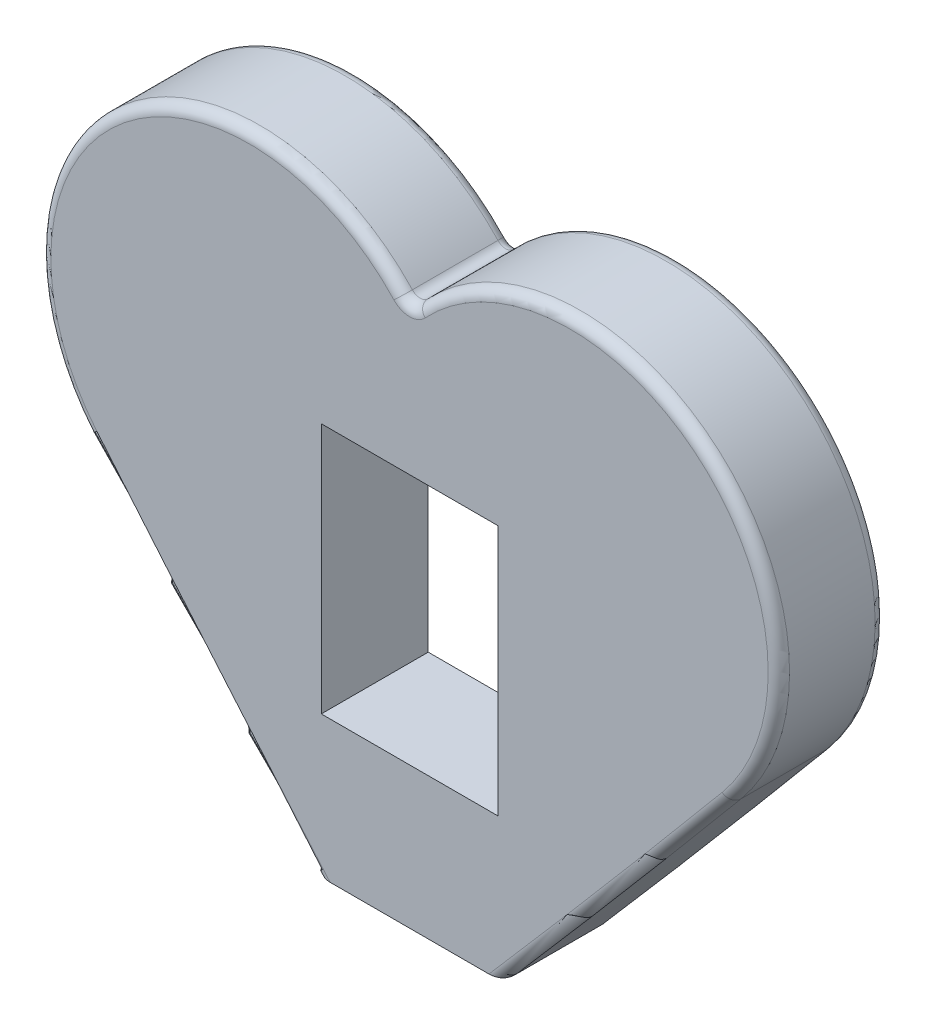
ISO-10303-21;
HEADER;
FILE_DESCRIPTION(('STEP AP214'),'2;1');
FILE_NAME('part.step','',(''),(''),'','','');
FILE_SCHEMA(('AUTOMOTIVE_DESIGN { 1 0 10303 214 1 1 1 1 }'));
ENDSEC;
DATA;
#1=APPLICATION_CONTEXT('core data for automotive mechanical design processes');
#2=APPLICATION_PROTOCOL_DEFINITION('international standard','automotive_design',2000,#1);
#3=PRODUCT_CONTEXT('',#1,'mechanical');
#4=PRODUCT('Part','Part','',(#3));
#5=PRODUCT_RELATED_PRODUCT_CATEGORY('part','',(#4));
#6=PRODUCT_DEFINITION_FORMATION('','',#4);
#7=PRODUCT_DEFINITION_CONTEXT('part definition',#1,'design');
#8=PRODUCT_DEFINITION('design','',#6,#7);
#9=PRODUCT_DEFINITION_SHAPE('','',#8);
#10=(LENGTH_UNIT() NAMED_UNIT(*) SI_UNIT(.MILLI.,.METRE.));
#11=(NAMED_UNIT(*) PLANE_ANGLE_UNIT() SI_UNIT($,.RADIAN.));
#12=(NAMED_UNIT(*) SI_UNIT($,.STERADIAN.) SOLID_ANGLE_UNIT());
#13=UNCERTAINTY_MEASURE_WITH_UNIT(LENGTH_MEASURE(1.E-05),#10,'distance_accuracy_value','');
#14=(GEOMETRIC_REPRESENTATION_CONTEXT(3) GLOBAL_UNCERTAINTY_ASSIGNED_CONTEXT((#13)) GLOBAL_UNIT_ASSIGNED_CONTEXT((#10,
#11,#12)) REPRESENTATION_CONTEXT('',''));
#15=CARTESIAN_POINT('',(0.,0.,0.));
#16=DIRECTION('',(0.,0.,1.));
#17=DIRECTION('',(1.,0.,0.));
#18=AXIS2_PLACEMENT_3D('',#15,#16,#17);
#19=CARTESIAN_POINT('',(2520.6972514821,2152.84342115565,-20.));
#20=DIRECTION('',(0.,0.,1.));
#21=DIRECTION('',(1.,0.,0.));
#22=AXIS2_PLACEMENT_3D('',#19,#20,#21);
#23=CYLINDRICAL_SURFACE('',#22,3360.76374967316);
#24=DIRECTION('',(0.,0.,1.));
#25=VECTOR('',#24,1.);
#26=CARTESIAN_POINT('',(-59.9999770017148,-2.18575157973078E-13,-20.));
#27=LINE('',#26,#25);
#28=CARTESIAN_POINT('',(-59.9999770017148,-2.18575157973078E-13,-18.));
#29=VERTEX_POINT('',#28);
#30=CARTESIAN_POINT('',(-59.9999770017148,-2.18575157973078E-13,-2.));
#31=VERTEX_POINT('',#30);
#32=EDGE_CURVE('E452',#29,#31,#27,.T.);
#33=ORIENTED_EDGE('',*,*,#32,.F.);
#34=CARTESIAN_POINT('',(2520.6972514821,2152.84342115565,-18.));
#35=DIRECTION('',(0.,0.,-1.));
#36=DIRECTION('',(-1.,0.,0.));
#37=AXIS2_PLACEMENT_3D('',#34,#35,#36);
#38=CIRCLE('',#37,3360.76374967316);
#39=CARTESIAN_POINT('',(-18.098243056407,-49.2579430027272,-18.));
#40=VERTEX_POINT('',#39);
#41=EDGE_CURVE('E228',#29,#40,#38,.F.);
#42=ORIENTED_EDGE('',*,*,#41,.T.);
#43=DIRECTION('',(0.,0.,1.));
#44=VECTOR('',#43,1.);
#45=CARTESIAN_POINT('',(-18.0982430564076,-49.2579430027273,-20.));
#46=LINE('',#45,#44);
#47=CARTESIAN_POINT('',(-18.098243056407,-49.2579430027272,-2.));
#48=VERTEX_POINT('',#47);
#49=EDGE_CURVE('E451',#40,#48,#46,.T.);
#50=ORIENTED_EDGE('',*,*,#49,.T.);
#51=CARTESIAN_POINT('',(2520.6972514821,2152.84342115565,-2.));
#52=DIRECTION('',(0.,0.,-1.));
#53=DIRECTION('',(-1.,0.,0.));
#54=AXIS2_PLACEMENT_3D('',#51,#52,#53);
#55=CIRCLE('',#54,3360.76374967316);
#56=EDGE_CURVE('E446',#48,#31,#55,.T.);
#57=ORIENTED_EDGE('',*,*,#56,.T.);
#58=EDGE_LOOP('',(#33,#42,#50,#57));
#59=FACE_BOUND('',#58,.T.);
#60=ADVANCED_FACE('F39',(#59),#23,.T.);
#61=CARTESIAN_POINT('',(-30.,25.0262806539722,-20.));
#62=DIRECTION('',(0.,0.,1.));
#63=DIRECTION('',(1.,0.,0.));
#64=AXIS2_PLACEMENT_3D('',#61,#62,#63);
#65=CYLINDRICAL_SURFACE('',#64,39.0680604007265);
#66=DIRECTION('',(0.,0.,1.));
#67=VECTOR('',#66,1.);
#68=CARTESIAN_POINT('',(-1.46098937750025,51.7065770571919,-20.));
#69=LINE('',#68,#67);
#70=CARTESIAN_POINT('',(-1.46098937750025,51.7065770571919,-2.));
#71=VERTEX_POINT('',#70);
#72=CARTESIAN_POINT('',(-1.46098937750025,51.7065770571919,-18.));
#73=VERTEX_POINT('',#72);
#74=EDGE_CURVE('E393',#71,#73,#69,.F.);
#75=ORIENTED_EDGE('',*,*,#74,.T.);
#76=CARTESIAN_POINT('',(-30.,25.0262806539722,-18.));
#77=DIRECTION('',(0.,0.,-1.));
#78=DIRECTION('',(-1.,0.,0.));
#79=AXIS2_PLACEMENT_3D('',#76,#77,#78);
#80=CIRCLE('',#79,39.0680604007265);
#81=EDGE_CURVE('E354',#73,#29,#80,.F.);
#82=ORIENTED_EDGE('',*,*,#81,.T.);
#83=ORIENTED_EDGE('',*,*,#32,.T.);
#84=CARTESIAN_POINT('',(-30.,25.0262806539722,-2.));
#85=DIRECTION('',(0.,0.,-1.));
#86=DIRECTION('',(-1.,0.,0.));
#87=AXIS2_PLACEMENT_3D('',#84,#85,#86);
#88=CIRCLE('',#87,39.0680604007265);
#89=EDGE_CURVE('E391',#31,#71,#88,.T.);
#90=ORIENTED_EDGE('',*,*,#89,.T.);
#91=EDGE_LOOP('',(#75,#82,#83,#90));
#92=FACE_BOUND('',#91,.T.);
#93=ADVANCED_FACE('F505',(#92),#65,.T.);
#94=CARTESIAN_POINT('',(30.,25.0262806539722,-20.));
#95=DIRECTION('',(0.,0.,1.));
#96=DIRECTION('',(1.,0.,0.));
#97=AXIS2_PLACEMENT_3D('',#94,#95,#96);
#98=CYLINDRICAL_SURFACE('',#97,39.0680604007265);
#99=DIRECTION('',(0.,0.,1.));
#100=VECTOR('',#99,1.);
#101=CARTESIAN_POINT('',(59.9999770017146,-8.88178419700125E-13,-20.));
#102=LINE('',#101,#100);
#103=CARTESIAN_POINT('',(59.9999770017146,-8.88178419700125E-13,-18.));
#104=VERTEX_POINT('',#103);
#105=CARTESIAN_POINT('',(59.9999770017146,-8.88178419700125E-13,-2.));
#106=VERTEX_POINT('',#105);
#107=EDGE_CURVE('E368',#104,#106,#102,.T.);
#108=ORIENTED_EDGE('',*,*,#107,.F.);
#109=CARTESIAN_POINT('',(30.,25.0262806539722,-18.));
#110=DIRECTION('',(0.,0.,-1.));
#111=DIRECTION('',(-1.,0.,0.));
#112=AXIS2_PLACEMENT_3D('',#109,#110,#111);
#113=CIRCLE('',#112,39.0680604007265);
#114=CARTESIAN_POINT('',(1.46098937750025,51.7065770571919,-18.));
#115=VERTEX_POINT('',#114);
#116=EDGE_CURVE('E169',#104,#115,#113,.F.);
#117=ORIENTED_EDGE('',*,*,#116,.T.);
#118=DIRECTION('',(0.,0.,1.));
#119=VECTOR('',#118,1.);
#120=CARTESIAN_POINT('',(1.46098937750025,51.7065770571919,-20.));
#121=LINE('',#120,#119);
#122=CARTESIAN_POINT('',(1.46098937750025,51.7065770571919,-2.));
#123=VERTEX_POINT('',#122);
#124=EDGE_CURVE('E359',#115,#123,#121,.T.);
#125=ORIENTED_EDGE('',*,*,#124,.T.);
#126=CARTESIAN_POINT('',(30.,25.0262806539722,-2.));
#127=DIRECTION('',(0.,0.,-1.));
#128=DIRECTION('',(-1.,0.,0.));
#129=AXIS2_PLACEMENT_3D('',#126,#127,#128);
#130=CIRCLE('',#129,39.0680604007265);
#131=EDGE_CURVE('E352',#123,#106,#130,.T.);
#132=ORIENTED_EDGE('',*,*,#131,.T.);
#133=EDGE_LOOP('',(#108,#117,#125,#132));
#134=FACE_BOUND('',#133,.T.);
#135=ADVANCED_FACE('F366',(#134),#98,.T.);
#136=CARTESIAN_POINT('',(-2520.6972514821,2152.84342115565,-20.));
#137=DIRECTION('',(0.,0.,1.));
#138=DIRECTION('',(1.,0.,0.));
#139=AXIS2_PLACEMENT_3D('',#136,#137,#138);
#140=CYLINDRICAL_SURFACE('',#139,3360.76374967316);
#141=DIRECTION('',(0.,0.,1.));
#142=VECTOR('',#141,1.);
#143=CARTESIAN_POINT('',(18.0982430564076,-49.2579430027273,-20.));
#144=LINE('',#143,#142);
#145=CARTESIAN_POINT('',(18.098243056407,-49.2579430027272,-2.));
#146=VERTEX_POINT('',#145);
#147=CARTESIAN_POINT('',(18.098243056407,-49.2579430027272,-18.));
#148=VERTEX_POINT('',#147);
#149=EDGE_CURVE('E343',#146,#148,#144,.F.);
#150=ORIENTED_EDGE('',*,*,#149,.T.);
#151=CARTESIAN_POINT('',(-2520.6972514821,2152.84342115565,-18.));
#152=DIRECTION('',(0.,0.,-1.));
#153=DIRECTION('',(-1.,0.,0.));
#154=AXIS2_PLACEMENT_3D('',#151,#152,#153);
#155=CIRCLE('',#154,3360.76374967316);
#156=EDGE_CURVE('E348',#148,#104,#155,.F.);
#157=ORIENTED_EDGE('',*,*,#156,.T.);
#158=ORIENTED_EDGE('',*,*,#107,.T.);
#159=CARTESIAN_POINT('',(-2520.6972514821,2152.84342115565,-2.));
#160=DIRECTION('',(0.,0.,-1.));
#161=DIRECTION('',(-1.,0.,0.));
#162=AXIS2_PLACEMENT_3D('',#159,#160,#161);
#163=CIRCLE('',#162,3360.76374967316);
#164=EDGE_CURVE('E338',#106,#146,#163,.T.);
#165=ORIENTED_EDGE('',*,*,#164,.T.);
#166=EDGE_LOOP('',(#150,#157,#158,#165));
#167=FACE_BOUND('',#166,.T.);
#168=ADVANCED_FACE('F237',(#167),#140,.T.);
#169=CARTESIAN_POINT('',(-17.5,-49.9474662610205,-20.));
#170=DIRECTION('',(0.,-1.,0.));
#171=DIRECTION('',(0.,0.,-1.));
#172=AXIS2_PLACEMENT_3D('',#169,#170,#171);
#173=PLANE('',#172);
#174=DIRECTION('',(0.,0.,-1.));
#175=VECTOR('',#174,1.);
#176=CARTESIAN_POINT('',(-16.5873986867098,-49.9474662610205,-20.));
#177=LINE('',#176,#175);
#178=CARTESIAN_POINT('',(-16.5873986867098,-49.9474662610205,-0.489450322608068));
#179=VERTEX_POINT('',#178);
#180=CARTESIAN_POINT('',(-16.5873986867098,-49.9474662610205,-19.5105496773919));
#181=VERTEX_POINT('',#180);
#182=EDGE_CURVE('E259',#179,#181,#177,.T.);
#183=ORIENTED_EDGE('',*,*,#182,.T.);
#184=CARTESIAN_POINT('',(-16.5873986867098,-49.9474662610205,-19.5105496773919));
#185=CARTESIAN_POINT('',(-16.5153228598377,-49.9474662610205,-19.5577619961102));
#186=CARTESIAN_POINT('',(-16.4409518324235,-49.9474662610205,-19.6013591802329));
#187=CARTESIAN_POINT('',(-16.2885779217159,-49.9474662610205,-19.6814631353796));
#188=CARTESIAN_POINT('',(-16.2105790636761,-49.9474662610205,-19.7179775429008));
#189=CARTESIAN_POINT('',(-16.0534828757159,-49.9474662610205,-19.7834344861935));
#190=CARTESIAN_POINT('',(-15.9744467690524,-49.9474662610205,-19.8125250123332));
#191=CARTESIAN_POINT('',(-15.8143151563635,-49.9474662610205,-19.8643192113937));
#192=CARTESIAN_POINT('',(-15.7332193019567,-49.9474662610205,-19.8870217959226));
#193=CARTESIAN_POINT('',(-15.5216560566419,-49.9474662610205,-19.9376261583661));
#194=CARTESIAN_POINT('',(-15.3900254952697,-49.9474662610205,-19.9608159704249));
#195=CARTESIAN_POINT('',(-15.1901607707434,-49.9474662610205,-19.984237116112));
#196=CARTESIAN_POINT('',(-15.1225264766685,-49.9474662610205,-19.9901504220553));
#197=CARTESIAN_POINT('',(-14.9870200709293,-49.9474662610205,-19.9980296242235));
#198=CARTESIAN_POINT('',(-14.9191479325005,-49.9474662610205,-19.9999950609092));
#199=CARTESIAN_POINT('',(-14.851255731397,-49.9474662610205,-20.));
#200=B_SPLINE_CURVE_WITH_KNOTS('',3,(#184,#185,#186,#187,#188,#189,#190,#191,#192,#193,#194,
#195,#196,#197,#198,#199),.UNSPECIFIED.,.F.,.F.,(4,2,2,2,2,2,2,4),(0.,0.25829175180928,
0.516303451908564,0.768678556067953,1.02109663447031,1.4209912929441,1.62457487932923,
1.82818216184009),.UNSPECIFIED.);
#201=CARTESIAN_POINT('',(-14.851255731397,-49.9474662610205,-20.));
#202=VERTEX_POINT('',#201);
#203=EDGE_CURVE('E426',#181,#202,#200,.T.);
#204=ORIENTED_EDGE('',*,*,#203,.T.);
#205=DIRECTION('',(1.,0.,0.));
#206=VECTOR('',#205,1.);
#207=CARTESIAN_POINT('',(-17.5,-49.9474662610205,-20.));
#208=LINE('',#207,#206);
#209=CARTESIAN_POINT('',(14.8512557313972,-49.9474662610205,-20.));
#210=VERTEX_POINT('',#209);
#211=EDGE_CURVE('E461',#202,#210,#208,.T.);
#212=ORIENTED_EDGE('',*,*,#211,.T.);
#213=CARTESIAN_POINT('',(14.8512557313972,-49.9474662610207,-20.));
#214=CARTESIAN_POINT('',(14.9367647935638,-49.9474662610206,-19.9999890761961));
#215=CARTESIAN_POINT('',(15.0222412485081,-49.9474662610205,-19.9968745349572));
#216=CARTESIAN_POINT('',(15.1927730242631,-49.9474662610204,-19.9843700942181));
#217=CARTESIAN_POINT('',(15.2778281289432,-49.9474662610204,-19.9749772545478));
#218=CARTESIAN_POINT('',(15.5277686945291,-49.9474662610205,-19.9378680026166));
#219=CARTESIAN_POINT('',(15.6914461582582,-49.9474662610205,-19.9012196923784));
#220=CARTESIAN_POINT('',(15.97978892835,-49.9474662610204,-19.8124702730638));
#221=CARTESIAN_POINT('',(16.1058200566767,-49.9474662610205,-19.7647971579575));
#222=CARTESIAN_POINT('',(16.2901510709762,-49.9474662610205,-19.6801305308862));
#223=CARTESIAN_POINT('',(16.3513427970364,-49.9474662610205,-19.6493738293372));
#224=CARTESIAN_POINT('',(16.4713089024383,-49.9474662610205,-19.5833609635013));
#225=CARTESIAN_POINT('',(16.5300812980831,-49.9474662610205,-19.5481012004758));
#226=CARTESIAN_POINT('',(16.5873986867099,-49.9474662610205,-19.5105496773925));
#227=B_SPLINE_CURVE_WITH_KNOTS('',3,(#213,#214,#215,#216,#217,#218,#219,#220,#221,#222,#223,
#224,#225,#226),.UNSPECIFIED.,.F.,.F.,(4,2,2,2,2,2,4),(0.,0.256402923976392,0.512926007407789,
1.01403560240191,1.41707289862381,1.62235933318566,1.82781086658069),.UNSPECIFIED.);
#228=CARTESIAN_POINT('',(16.5873986867098,-49.9474662610205,-19.5105496773919));
#229=VERTEX_POINT('',#228);
#230=EDGE_CURVE('E245',#210,#229,#227,.T.);
#231=ORIENTED_EDGE('',*,*,#230,.T.);
#232=DIRECTION('',(0.,0.,1.));
#233=VECTOR('',#232,1.);
#234=CARTESIAN_POINT('',(16.5873986867098,-49.9474662610205,-20.));
#235=LINE('',#234,#233);
#236=CARTESIAN_POINT('',(16.5873986867098,-49.9474662610205,-0.489450322608068));
#237=VERTEX_POINT('',#236);
#238=EDGE_CURVE('E227',#229,#237,#235,.T.);
#239=ORIENTED_EDGE('',*,*,#238,.T.);
#240=CARTESIAN_POINT('',(16.5873986867098,-49.9474662610205,-0.489450322608068));
#241=CARTESIAN_POINT('',(16.5153228598377,-49.9474662610205,-0.442238003889821));
#242=CARTESIAN_POINT('',(16.4409518324235,-49.9474662610205,-0.39864081976712));
#243=CARTESIAN_POINT('',(16.2885779217159,-49.9474662610205,-0.318536864620431));
#244=CARTESIAN_POINT('',(16.2105790636761,-49.9474662610205,-0.282022457099194));
#245=CARTESIAN_POINT('',(16.0534828757159,-49.9474662610205,-0.216565513806549));
#246=CARTESIAN_POINT('',(15.9744467690524,-49.9474662610205,-0.187474987666843));
#247=CARTESIAN_POINT('',(15.8143151563635,-49.9474662610205,-0.135680788606253));
#248=CARTESIAN_POINT('',(15.7332193019567,-49.9474662610205,-0.112978204077412));
#249=CARTESIAN_POINT('',(15.5216560566419,-49.9474662610205,-0.0623738416339182));
#250=CARTESIAN_POINT('',(15.3900254952698,-49.9474662610205,-0.03918402957513));
#251=CARTESIAN_POINT('',(15.1901607707435,-49.9474662610205,-0.0157628838880028));
#252=CARTESIAN_POINT('',(15.1225264766686,-49.9474662610205,-0.00984957794469531));
#253=CARTESIAN_POINT('',(14.9870200709294,-49.9474662610205,-0.00197037577653597));
#254=CARTESIAN_POINT('',(14.9191479325007,-49.9474662610205,-4.93909082584249E-06));
#255=CARTESIAN_POINT('',(14.8512557313971,-49.9474662610205,0.));
#256=B_SPLINE_CURVE_WITH_KNOTS('',3,(#240,#241,#242,#243,#244,#245,#246,#247,#248,#249,#250,
#251,#252,#253,#254,#255),.UNSPECIFIED.,.F.,.F.,(4,2,2,2,2,2,2,4),(0.,0.258291751809279,
0.516303451908564,0.768678556067953,1.02109663447031,1.42099129294403,1.62457487932912,
1.82818216183994),.UNSPECIFIED.);
#257=CARTESIAN_POINT('',(14.8512557313971,-49.9474662610205,0.));
#258=VERTEX_POINT('',#257);
#259=EDGE_CURVE('E218',#237,#258,#256,.T.);
#260=ORIENTED_EDGE('',*,*,#259,.T.);
#261=DIRECTION('',(1.,0.,0.));
#262=VECTOR('',#261,1.);
#263=CARTESIAN_POINT('',(-17.5,-49.9474662610205,0.));
#264=LINE('',#263,#262);
#265=CARTESIAN_POINT('',(-14.8512557313971,-49.9474662610205,0.));
#266=VERTEX_POINT('',#265);
#267=EDGE_CURVE('E196',#266,#258,#264,.T.);
#268=ORIENTED_EDGE('',*,*,#267,.F.);
#269=CARTESIAN_POINT('',(-14.8512557313971,-49.9474662610205,0.));
#270=CARTESIAN_POINT('',(-14.9367647935637,-49.9474662610205,-1.09238039322817E-05));
#271=CARTESIAN_POINT('',(-15.0222412485079,-49.9474662610205,-0.00312546504284668));
#272=CARTESIAN_POINT('',(-15.1927730242629,-49.9474662610205,-0.0156299057818686));
#273=CARTESIAN_POINT('',(-15.2778281289431,-49.9474662610205,-0.0250227454522135));
#274=CARTESIAN_POINT('',(-15.527768694529,-49.9474662610205,-0.0621319973834192));
#275=CARTESIAN_POINT('',(-15.691446158258,-49.9474662610205,-0.0987803076216164));
#276=CARTESIAN_POINT('',(-15.9797889283499,-49.9474662610205,-0.187529726936163));
#277=CARTESIAN_POINT('',(-16.1058200566766,-49.9474662610205,-0.235202842042507));
#278=CARTESIAN_POINT('',(-16.2901510709762,-49.9474662610205,-0.319869469113779));
#279=CARTESIAN_POINT('',(-16.3513427970363,-49.9474662610205,-0.350626170662773));
#280=CARTESIAN_POINT('',(-16.4713089024382,-49.9474662610205,-0.416639036498691));
#281=CARTESIAN_POINT('',(-16.5300812980831,-49.9474662610205,-0.45189879952423));
#282=CARTESIAN_POINT('',(-16.5873986867099,-49.9474662610205,-0.489450322607518));
#283=B_SPLINE_CURVE_WITH_KNOTS('',3,(#269,#270,#271,#272,#273,#274,#275,#276,#277,#278,#279,
#280,#281,#282),.UNSPECIFIED.,.F.,.F.,(4,2,2,2,2,2,4),(0.,0.256402923976391,0.512926007407789,
1.01403560240191,1.41707289862386,1.62235933318575,1.82781086658081),.UNSPECIFIED.);
#284=EDGE_CURVE('E251',#266,#179,#283,.T.);
#285=ORIENTED_EDGE('',*,*,#284,.T.);
#286=EDGE_LOOP('',(#183,#204,#212,#231,#239,#260,#268,#285));
#287=FACE_BOUND('',#286,.T.);
#288=ADVANCED_FACE('F231',(#287),#173,.T.);
#289=CARTESIAN_POINT('',(2520.6972514821,2152.84342115565,-20.));
#290=DIRECTION('',(0.,0.,-1.));
#291=DIRECTION('',(-1.,0.,0.));
#292=AXIS2_PLACEMENT_3D('',#289,#290,#291);
#293=PLANE('',#292);
#294=DIRECTION('',(0.,-1.,0.));
#295=VECTOR('',#294,1.);
#296=CARTESIAN_POINT('',(16.5000000000002,2152.84342115565,-20.));
#297=LINE('',#296,#295);
#298=CARTESIAN_POINT('',(16.5,23.5,-20.));
#299=VERTEX_POINT('',#298);
#300=CARTESIAN_POINT('',(16.5,-23.5,-20.));
#301=VERTEX_POINT('',#300);
#302=EDGE_CURVE('E283',#299,#301,#297,.T.);
#303=ORIENTED_EDGE('',*,*,#302,.F.);
#304=DIRECTION('',(1.,0.,0.));
#305=VECTOR('',#304,1.);
#306=CARTESIAN_POINT('',(2520.6972514821,23.4999999999999,-20.));
#307=LINE('',#306,#305);
#308=CARTESIAN_POINT('',(-16.4999999999997,23.4999999999999,-20.));
#309=VERTEX_POINT('',#308);
#310=EDGE_CURVE('E474',#309,#299,#307,.T.);
#311=ORIENTED_EDGE('',*,*,#310,.F.);
#312=DIRECTION('',(0.,1.,0.));
#313=VECTOR('',#312,1.);
#314=CARTESIAN_POINT('',(-16.5000000000002,2152.84342115565,-20.));
#315=LINE('',#314,#313);
#316=CARTESIAN_POINT('',(-16.5,-23.5,-20.));
#317=VERTEX_POINT('',#316);
#318=EDGE_CURVE('E176',#317,#309,#315,.T.);
#319=ORIENTED_EDGE('',*,*,#318,.F.);
#320=DIRECTION('',(-1.,0.,0.));
#321=VECTOR('',#320,1.);
#322=CARTESIAN_POINT('',(2520.6972514821,-23.4999999999999,-20.));
#323=LINE('',#322,#321);
#324=EDGE_CURVE('E469',#301,#317,#323,.T.);
#325=ORIENTED_EDGE('',*,*,#324,.F.);
#326=EDGE_LOOP('',(#303,#311,#319,#325));
#327=FACE_BOUND('',#326,.T.);
#328=ORIENTED_EDGE('',*,*,#211,.F.);
#329=CARTESIAN_POINT('',(2520.6972514821,2152.84342115565,-20.));
#330=DIRECTION('',(0.,0.,-1.));
#331=DIRECTION('',(-1.,0.,0.));
#332=AXIS2_PLACEMENT_3D('',#329,#330,#331);
#333=CIRCLE('',#332,3358.76374967316);
#334=CARTESIAN_POINT('',(-58.4641967917939,1.28116320069487,-20.));
#335=VERTEX_POINT('',#334);
#336=EDGE_CURVE('E414',#202,#335,#333,.T.);
#337=ORIENTED_EDGE('',*,*,#336,.T.);
#338=CARTESIAN_POINT('',(-30.,25.0262806539722,-20.));
#339=DIRECTION('',(0.,0.,-1.));
#340=DIRECTION('',(-1.,0.,0.));
#341=AXIS2_PLACEMENT_3D('',#338,#339,#340);
#342=CIRCLE('',#341,37.0680604007265);
#343=CARTESIAN_POINT('',(-2.9219787550005,50.3407403030989,-20.));
#344=VERTEX_POINT('',#343);
#345=EDGE_CURVE('E417',#335,#344,#342,.T.);
#346=ORIENTED_EDGE('',*,*,#345,.T.);
#347=CARTESIAN_POINT('',(0.,53.072413811285,-20.));
#348=DIRECTION('',(0.,0.,-1.));
#349=DIRECTION('',(-1.,0.,0.));
#350=AXIS2_PLACEMENT_3D('',#347,#348,#349);
#351=CIRCLE('',#350,4.);
#352=CARTESIAN_POINT('',(2.9219787550005,50.3407403030989,-20.));
#353=VERTEX_POINT('',#352);
#354=EDGE_CURVE('E381',#353,#344,#351,.T.);
#355=ORIENTED_EDGE('',*,*,#354,.F.);
#356=CARTESIAN_POINT('',(30.,25.0262806539722,-20.));
#357=DIRECTION('',(0.,0.,-1.));
#358=DIRECTION('',(-1.,0.,0.));
#359=AXIS2_PLACEMENT_3D('',#356,#357,#358);
#360=CIRCLE('',#359,37.0680604007265);
#361=CARTESIAN_POINT('',(58.4641967917934,1.28116320069438,-20.));
#362=VERTEX_POINT('',#361);
#363=EDGE_CURVE('E376',#353,#362,#360,.T.);
#364=ORIENTED_EDGE('',*,*,#363,.T.);
#365=CARTESIAN_POINT('',(-2520.6972514821,2152.84342115565,-20.));
#366=DIRECTION('',(0.,0.,-1.));
#367=DIRECTION('',(-1.,0.,0.));
#368=AXIS2_PLACEMENT_3D('',#365,#366,#367);
#369=CIRCLE('',#368,3358.76374967316);
#370=EDGE_CURVE('E422',#362,#210,#369,.T.);
#371=ORIENTED_EDGE('',*,*,#370,.T.);
#372=EDGE_LOOP('',(#328,#337,#346,#355,#364,#371));
#373=FACE_BOUND('',#372,.T.);
#374=ADVANCED_FACE('F236',(#327,#373),#293,.T.);
#375=CARTESIAN_POINT('',(2520.6972514821,2152.84342115565,0.));
#376=DIRECTION('',(0.,0.,-1.));
#377=DIRECTION('',(-1.,0.,0.));
#378=AXIS2_PLACEMENT_3D('',#375,#376,#377);
#379=PLANE('',#378);
#380=DIRECTION('',(1.,0.,0.));
#381=VECTOR('',#380,1.);
#382=CARTESIAN_POINT('',(2520.6972514821,23.4999999999999,0.));
#383=LINE('',#382,#381);
#384=CARTESIAN_POINT('',(-16.5,23.5,0.));
#385=VERTEX_POINT('',#384);
#386=CARTESIAN_POINT('',(16.4999999999997,23.4999999999999,0.));
#387=VERTEX_POINT('',#386);
#388=EDGE_CURVE('E163',#385,#387,#383,.T.);
#389=ORIENTED_EDGE('',*,*,#388,.T.);
#390=DIRECTION('',(0.,-1.,0.));
#391=VECTOR('',#390,1.);
#392=CARTESIAN_POINT('',(16.5000000000002,2152.84342115565,0.));
#393=LINE('',#392,#391);
#394=CARTESIAN_POINT('',(16.5,-23.5,0.));
#395=VERTEX_POINT('',#394);
#396=EDGE_CURVE('E11',#387,#395,#393,.T.);
#397=ORIENTED_EDGE('',*,*,#396,.T.);
#398=DIRECTION('',(-1.,0.,0.));
#399=VECTOR('',#398,1.);
#400=CARTESIAN_POINT('',(2520.6972514821,-23.4999999999999,0.));
#401=LINE('',#400,#399);
#402=CARTESIAN_POINT('',(-16.5,-23.5,0.));
#403=VERTEX_POINT('',#402);
#404=EDGE_CURVE('E49',#395,#403,#401,.T.);
#405=ORIENTED_EDGE('',*,*,#404,.T.);
#406=DIRECTION('',(0.,1.,0.));
#407=VECTOR('',#406,1.);
#408=CARTESIAN_POINT('',(-16.5000000000002,2152.84342115565,0.));
#409=LINE('',#408,#407);
#410=EDGE_CURVE('E168',#403,#385,#409,.T.);
#411=ORIENTED_EDGE('',*,*,#410,.T.);
#412=EDGE_LOOP('',(#389,#397,#405,#411));
#413=FACE_BOUND('',#412,.T.);
#414=CARTESIAN_POINT('',(-30.,25.0262806539722,0.));
#415=DIRECTION('',(0.,0.,-1.));
#416=DIRECTION('',(-1.,0.,0.));
#417=AXIS2_PLACEMENT_3D('',#414,#415,#416);
#418=CIRCLE('',#417,37.0680604007265);
#419=CARTESIAN_POINT('',(-2.9219787550005,50.3407403030989,0.));
#420=VERTEX_POINT('',#419);
#421=CARTESIAN_POINT('',(-58.4641967917938,1.28116320069488,0.));
#422=VERTEX_POINT('',#421);
#423=EDGE_CURVE('E401',#420,#422,#418,.F.);
#424=ORIENTED_EDGE('',*,*,#423,.T.);
#425=CARTESIAN_POINT('',(2520.6972514821,2152.84342115565,0.));
#426=DIRECTION('',(0.,0.,-1.));
#427=DIRECTION('',(-1.,0.,0.));
#428=AXIS2_PLACEMENT_3D('',#425,#426,#427);
#429=CIRCLE('',#428,3358.76374967316);
#430=EDGE_CURVE('E398',#422,#266,#429,.F.);
#431=ORIENTED_EDGE('',*,*,#430,.T.);
#432=ORIENTED_EDGE('',*,*,#267,.T.);
#433=CARTESIAN_POINT('',(-2520.6972514821,2152.84342115565,0.));
#434=DIRECTION('',(0.,0.,-1.));
#435=DIRECTION('',(-1.,0.,0.));
#436=AXIS2_PLACEMENT_3D('',#433,#434,#435);
#437=CIRCLE('',#436,3358.76374967316);
#438=CARTESIAN_POINT('',(58.4641967917934,1.28116320069438,0.));
#439=VERTEX_POINT('',#438);
#440=EDGE_CURVE('E404',#258,#439,#437,.F.);
#441=ORIENTED_EDGE('',*,*,#440,.T.);
#442=CARTESIAN_POINT('',(30.,25.0262806539722,0.));
#443=DIRECTION('',(0.,0.,-1.));
#444=DIRECTION('',(-1.,0.,0.));
#445=AXIS2_PLACEMENT_3D('',#442,#443,#444);
#446=CIRCLE('',#445,37.0680604007265);
#447=CARTESIAN_POINT('',(2.9219787550005,50.3407403030989,0.));
#448=VERTEX_POINT('',#447);
#449=EDGE_CURVE('E407',#439,#448,#446,.F.);
#450=ORIENTED_EDGE('',*,*,#449,.T.);
#451=CARTESIAN_POINT('',(0.,53.072413811285,0.));
#452=DIRECTION('',(0.,0.,-1.));
#453=DIRECTION('',(-1.,0.,0.));
#454=AXIS2_PLACEMENT_3D('',#451,#452,#453);
#455=CIRCLE('',#454,4.);
#456=EDGE_CURVE('E410',#420,#448,#455,.F.);
#457=ORIENTED_EDGE('',*,*,#456,.F.);
#458=EDGE_LOOP('',(#424,#431,#432,#441,#450,#457));
#459=FACE_BOUND('',#458,.T.);
#460=ADVANCED_FACE('F182',(#413,#459),#379,.F.);
#461=CARTESIAN_POINT('',(16.5873986867098,-47.9474662610206,-20.));
#462=DIRECTION('',(0.,0.,1.));
#463=DIRECTION('',(1.,0.,0.));
#464=AXIS2_PLACEMENT_3D('',#461,#462,#463);
#465=CYLINDRICAL_SURFACE('',#464,2.);
#466=CARTESIAN_POINT('',(16.5873986867098,-49.9474662610205,-0.489450322608068));
#467=CARTESIAN_POINT('',(16.65891597728,-49.947447030068,-0.536328735733011));
#468=CARTESIAN_POINT('',(16.7290451314486,-49.9436319297468,-0.585162731139008));
#469=CARTESIAN_POINT('',(16.8661286556314,-49.9291497130333,-0.685922463320777));
#470=CARTESIAN_POINT('',(16.9330885791726,-49.9184950980939,-0.737842402727924));
#471=CARTESIAN_POINT('',(17.0635030398616,-49.891109093184,-0.843972288291616));
#472=CARTESIAN_POINT('',(17.1269674362782,-49.8743959221352,-0.898174942589819));
#473=CARTESIAN_POINT('',(17.250477129971,-49.8354598925662,-1.00849894678895));
#474=CARTESIAN_POINT('',(17.3105204093732,-49.8132338229135,-1.06462139844318));
#475=CARTESIAN_POINT('',(17.5121322944069,-49.7276762098296,-1.26131733403588));
#476=CARTESIAN_POINT('',(17.6448444529864,-49.651681180862,-1.40564746677589));
#477=CARTESIAN_POINT('',(17.8872130342319,-49.4748646871079,-1.69794745322147));
#478=CARTESIAN_POINT('',(17.996889663946,-49.3740651511545,-1.84591398865913));
#479=CARTESIAN_POINT('',(18.0954765962132,-49.2611273387984,-1.99578304631123));
#480=CARTESIAN_POINT('',(18.0968610981335,-49.2595362421252,-1.9978915471641));
#481=CARTESIAN_POINT('',(18.0982430564073,-49.257943002727,-2.));
#482=B_SPLINE_CURVE_WITH_KNOTS('',3,(#466,#467,#468,#469,#470,#471,#472,#473,#474,#475,#476,
#477,#478,#479,#480,#481),.UNSPECIFIED.,.F.,.F.,(4,2,2,2,2,2,2,4),(0.,0.2562899958721,
0.512112866578644,0.767172738739153,1.02238152753976,1.64990972510462,2.27688512667897,
2.28583206675667),.UNSPECIFIED.);
#483=EDGE_CURVE('E197',#237,#146,#482,.T.);
#484=ORIENTED_EDGE('',*,*,#483,.F.);
#485=ORIENTED_EDGE('',*,*,#238,.F.);
#486=CARTESIAN_POINT('',(16.5873986867098,-49.9474662610205,-19.5105496773919));
#487=CARTESIAN_POINT('',(16.6589159772813,-49.9474470300669,-19.4636712642686));
#488=CARTESIAN_POINT('',(16.7290451314496,-49.9436319297463,-19.4148372688618));
#489=CARTESIAN_POINT('',(16.8661286556316,-49.9291497130337,-19.3140775366781));
#490=CARTESIAN_POINT('',(16.9330885791723,-49.9184950980949,-19.2621575972699));
#491=CARTESIAN_POINT('',(17.0635030398629,-49.8911090931828,-19.1560277117088));
#492=CARTESIAN_POINT('',(17.1269674362816,-49.8743959221314,-19.1018250574143));
#493=CARTESIAN_POINT('',(17.2504771299677,-49.8354598925699,-18.9915010532056));
#494=CARTESIAN_POINT('',(17.3105204093611,-49.8132338229275,-18.9353786015381));
#495=CARTESIAN_POINT('',(17.5121322944369,-49.7276762097953,-18.7386826660101));
#496=CARTESIAN_POINT('',(17.6448444531735,-49.6516811806472,-18.5943525335095));
#497=CARTESIAN_POINT('',(17.8872130340434,-49.4748646873236,-18.3020525464925));
#498=CARTESIAN_POINT('',(17.9968896632253,-49.3740651519802,-18.1540860102448));
#499=CARTESIAN_POINT('',(18.0954765961927,-49.2611273388218,-18.0042169536576));
#500=CARTESIAN_POINT('',(18.0968610981232,-49.2595362421371,-18.0021084528201));
#501=CARTESIAN_POINT('',(18.0982430564073,-49.257943002727,-18.));
#502=B_SPLINE_CURVE_WITH_KNOTS('',3,(#486,#487,#488,#489,#490,#491,#492,#493,#494,#495,#496,
#497,#498,#499,#500,#501),.UNSPECIFIED.,.F.,.F.,(4,2,2,2,2,2,2,4),(0.,0.256289995872684,
0.512112866579745,0.767172738739664,1.02238152753974,1.64990972510405,2.27688512667895,
2.28583206675661),.UNSPECIFIED.);
#503=EDGE_CURVE('E188',#148,#229,#502,.F.);
#504=ORIENTED_EDGE('',*,*,#503,.F.);
#505=ORIENTED_EDGE('',*,*,#149,.F.);
#506=EDGE_LOOP('',(#484,#485,#504,#505));
#507=FACE_BOUND('',#506,.T.);
#508=ADVANCED_FACE('F204',(#507),#465,.T.);
#509=CARTESIAN_POINT('',(-2520.6972514821,2152.84342115565,-18.));
#510=DIRECTION('',(0.,0.,-1.));
#511=DIRECTION('',(-1.,0.,0.));
#512=AXIS2_PLACEMENT_3D('',#509,#510,#511);
#513=TOROIDAL_SURFACE('',#512,3358.76374967316,2.);
#514=ORIENTED_EDGE('',*,*,#230,.F.);
#515=ORIENTED_EDGE('',*,*,#370,.F.);
#516=CARTESIAN_POINT('',(58.4641967917936,1.2811632006942,-18.));
#517=DIRECTION('',(0.640581600347546,0.767890104960454,0.));
#518=DIRECTION('',(-0.767890104960454,0.640581600347546,0.));
#519=AXIS2_PLACEMENT_3D('',#516,#517,#518);
#520=CIRCLE('',#519,2.);
#521=EDGE_CURVE('E326',#104,#362,#520,.T.);
#522=ORIENTED_EDGE('',*,*,#521,.F.);
#523=ORIENTED_EDGE('',*,*,#156,.F.);
#524=ORIENTED_EDGE('',*,*,#503,.T.);
#525=EDGE_LOOP('',(#514,#515,#522,#523,#524));
#526=FACE_BOUND('',#525,.T.);
#527=ADVANCED_FACE('F41',(#526),#513,.T.);
#528=CARTESIAN_POINT('',(-2520.6972514821,2152.84342115565,-2.));
#529=DIRECTION('',(0.,0.,-1.));
#530=DIRECTION('',(-1.,0.,0.));
#531=AXIS2_PLACEMENT_3D('',#528,#529,#530);
#532=TOROIDAL_SURFACE('',#531,3358.76374967316,2.);
#533=ORIENTED_EDGE('',*,*,#483,.T.);
#534=ORIENTED_EDGE('',*,*,#164,.F.);
#535=CARTESIAN_POINT('',(58.4641967917936,1.2811632006942,-2.));
#536=DIRECTION('',(0.640581600347546,0.767890104960454,0.));
#537=DIRECTION('',(-0.767890104960454,0.640581600347546,0.));
#538=AXIS2_PLACEMENT_3D('',#535,#536,#537);
#539=CIRCLE('',#538,2.);
#540=EDGE_CURVE('E323',#439,#106,#539,.T.);
#541=ORIENTED_EDGE('',*,*,#540,.F.);
#542=ORIENTED_EDGE('',*,*,#440,.F.);
#543=ORIENTED_EDGE('',*,*,#259,.F.);
#544=EDGE_LOOP('',(#533,#534,#541,#542,#543));
#545=FACE_BOUND('',#544,.T.);
#546=ADVANCED_FACE('F208',(#545),#532,.T.);
#547=CARTESIAN_POINT('',(30.,25.0262806539722,-18.));
#548=DIRECTION('',(0.,0.,-1.));
#549=DIRECTION('',(-1.,0.,0.));
#550=AXIS2_PLACEMENT_3D('',#547,#548,#549);
#551=TOROIDAL_SURFACE('',#550,37.0680604007265,2.);
#552=ORIENTED_EDGE('',*,*,#521,.T.);
#553=ORIENTED_EDGE('',*,*,#363,.F.);
#554=CARTESIAN_POINT('',(2.9219787550005,50.3407403030989,-18.));
#555=DIRECTION('',(-0.682918377046524,-0.730494688750125,0.));
#556=DIRECTION('',(0.730494688750125,-0.682918377046524,0.));
#557=AXIS2_PLACEMENT_3D('',#554,#555,#556);
#558=CIRCLE('',#557,2.);
#559=EDGE_CURVE('E319',#115,#353,#558,.T.);
#560=ORIENTED_EDGE('',*,*,#559,.F.);
#561=ORIENTED_EDGE('',*,*,#116,.F.);
#562=EDGE_LOOP('',(#552,#553,#560,#561));
#563=FACE_BOUND('',#562,.T.);
#564=ADVANCED_FACE('F213',(#563),#551,.T.);
#565=CARTESIAN_POINT('',(0.,53.072413811285,-20.));
#566=DIRECTION('',(0.,0.,-1.));
#567=DIRECTION('',(-1.,0.,0.));
#568=AXIS2_PLACEMENT_3D('',#565,#566,#567);
#569=CYLINDRICAL_SURFACE('',#568,2.);
#570=CARTESIAN_POINT('',(0.,53.072413811285,-2.));
#571=DIRECTION('',(0.,0.,-1.));
#572=DIRECTION('',(-1.,0.,0.));
#573=AXIS2_PLACEMENT_3D('',#570,#571,#572);
#574=CIRCLE('',#573,2.);
#575=EDGE_CURVE('E311',#123,#71,#574,.T.);
#576=ORIENTED_EDGE('',*,*,#575,.F.);
#577=ORIENTED_EDGE('',*,*,#124,.F.);
#578=CARTESIAN_POINT('',(0.,53.072413811285,-18.));
#579=DIRECTION('',(0.,0.,-1.));
#580=DIRECTION('',(-1.,0.,0.));
#581=AXIS2_PLACEMENT_3D('',#578,#579,#580);
#582=CIRCLE('',#581,2.);
#583=EDGE_CURVE('E315',#73,#115,#582,.F.);
#584=ORIENTED_EDGE('',*,*,#583,.F.);
#585=ORIENTED_EDGE('',*,*,#74,.F.);
#586=EDGE_LOOP('',(#576,#577,#584,#585));
#587=FACE_BOUND('',#586,.T.);
#588=ADVANCED_FACE('F373',(#587),#569,.F.);
#589=CARTESIAN_POINT('',(30.,25.0262806539722,-2.));
#590=DIRECTION('',(0.,0.,-1.));
#591=DIRECTION('',(-1.,0.,0.));
#592=AXIS2_PLACEMENT_3D('',#589,#590,#591);
#593=TOROIDAL_SURFACE('',#592,37.0680604007265,2.);
#594=ORIENTED_EDGE('',*,*,#540,.T.);
#595=ORIENTED_EDGE('',*,*,#131,.F.);
#596=CARTESIAN_POINT('',(2.9219787550005,50.3407403030989,-2.));
#597=DIRECTION('',(-0.682918377046524,-0.730494688750125,0.));
#598=DIRECTION('',(0.730494688750125,-0.682918377046524,0.));
#599=AXIS2_PLACEMENT_3D('',#596,#597,#598);
#600=CIRCLE('',#599,2.);
#601=EDGE_CURVE('E307',#448,#123,#600,.T.);
#602=ORIENTED_EDGE('',*,*,#601,.F.);
#603=ORIENTED_EDGE('',*,*,#449,.F.);
#604=EDGE_LOOP('',(#594,#595,#602,#603));
#605=FACE_BOUND('',#604,.T.);
#606=ADVANCED_FACE('F556',(#605),#593,.T.);
#607=CARTESIAN_POINT('',(0.,53.072413811285,-18.));
#608=DIRECTION('',(0.,0.,-1.));
#609=DIRECTION('',(-1.,0.,0.));
#610=AXIS2_PLACEMENT_3D('',#607,#608,#609);
#611=TOROIDAL_SURFACE('',#610,4.,2.);
#612=ORIENTED_EDGE('',*,*,#559,.T.);
#613=ORIENTED_EDGE('',*,*,#354,.T.);
#614=CARTESIAN_POINT('',(-2.9219787550005,50.3407403030989,-18.));
#615=DIRECTION('',(0.682918377046524,-0.730494688750125,0.));
#616=DIRECTION('',(0.730494688750125,0.682918377046524,0.));
#617=AXIS2_PLACEMENT_3D('',#614,#615,#616);
#618=CIRCLE('',#617,2.);
#619=EDGE_CURVE('E303',#73,#344,#618,.F.);
#620=ORIENTED_EDGE('',*,*,#619,.F.);
#621=ORIENTED_EDGE('',*,*,#583,.T.);
#622=EDGE_LOOP('',(#612,#613,#620,#621));
#623=FACE_BOUND('',#622,.T.);
#624=ADVANCED_FACE('F379',(#623),#611,.T.);
#625=CARTESIAN_POINT('',(0.,53.072413811285,-2.));
#626=DIRECTION('',(0.,0.,-1.));
#627=DIRECTION('',(-1.,0.,0.));
#628=AXIS2_PLACEMENT_3D('',#625,#626,#627);
#629=TOROIDAL_SURFACE('',#628,4.,2.);
#630=ORIENTED_EDGE('',*,*,#601,.T.);
#631=ORIENTED_EDGE('',*,*,#575,.T.);
#632=CARTESIAN_POINT('',(-2.9219787550005,50.3407403030989,-2.));
#633=DIRECTION('',(0.682918377046524,-0.730494688750125,0.));
#634=DIRECTION('',(0.730494688750125,0.682918377046524,0.));
#635=AXIS2_PLACEMENT_3D('',#632,#633,#634);
#636=CIRCLE('',#635,2.);
#637=EDGE_CURVE('E299',#420,#71,#636,.F.);
#638=ORIENTED_EDGE('',*,*,#637,.F.);
#639=ORIENTED_EDGE('',*,*,#456,.T.);
#640=EDGE_LOOP('',(#630,#631,#638,#639));
#641=FACE_BOUND('',#640,.T.);
#642=ADVANCED_FACE('F569',(#641),#629,.T.);
#643=CARTESIAN_POINT('',(-30.,25.0262806539722,-18.));
#644=DIRECTION('',(0.,0.,-1.));
#645=DIRECTION('',(-1.,0.,0.));
#646=AXIS2_PLACEMENT_3D('',#643,#644,#645);
#647=TOROIDAL_SURFACE('',#646,37.0680604007265,2.);
#648=ORIENTED_EDGE('',*,*,#619,.T.);
#649=ORIENTED_EDGE('',*,*,#345,.F.);
#650=CARTESIAN_POINT('',(-58.4641967917939,1.2811632006949,-18.));
#651=DIRECTION('',(0.640581600347559,-0.767890104960443,0.));
#652=DIRECTION('',(0.767890104960443,0.640581600347559,0.));
#653=AXIS2_PLACEMENT_3D('',#650,#651,#652);
#654=CIRCLE('',#653,2.);
#655=EDGE_CURVE('E295',#29,#335,#654,.T.);
#656=ORIENTED_EDGE('',*,*,#655,.F.);
#657=ORIENTED_EDGE('',*,*,#81,.F.);
#658=EDGE_LOOP('',(#648,#649,#656,#657));
#659=FACE_BOUND('',#658,.T.);
#660=ADVANCED_FACE('F385',(#659),#647,.T.);
#661=CARTESIAN_POINT('',(-30.,25.0262806539722,-2.));
#662=DIRECTION('',(0.,0.,-1.));
#663=DIRECTION('',(-1.,0.,0.));
#664=AXIS2_PLACEMENT_3D('',#661,#662,#663);
#665=TOROIDAL_SURFACE('',#664,37.0680604007265,2.);
#666=ORIENTED_EDGE('',*,*,#637,.T.);
#667=ORIENTED_EDGE('',*,*,#89,.F.);
#668=CARTESIAN_POINT('',(-58.4641967917938,1.28116320069488,-2.));
#669=DIRECTION('',(0.640581600347545,-0.767890104960454,0.));
#670=DIRECTION('',(0.767890104960455,0.640581600347545,0.));
#671=AXIS2_PLACEMENT_3D('',#668,#669,#670);
#672=CIRCLE('',#671,2.);
#673=EDGE_CURVE('E291',#422,#31,#672,.T.);
#674=ORIENTED_EDGE('',*,*,#673,.F.);
#675=ORIENTED_EDGE('',*,*,#423,.F.);
#676=EDGE_LOOP('',(#666,#667,#674,#675));
#677=FACE_BOUND('',#676,.T.);
#678=ADVANCED_FACE('F499',(#677),#665,.T.);
#679=CARTESIAN_POINT('',(2520.6972514821,2152.84342115565,-18.));
#680=DIRECTION('',(0.,0.,-1.));
#681=DIRECTION('',(-1.,0.,0.));
#682=AXIS2_PLACEMENT_3D('',#679,#680,#681);
#683=TOROIDAL_SURFACE('',#682,3358.76374967316,2.);
#684=ORIENTED_EDGE('',*,*,#336,.F.);
#685=ORIENTED_EDGE('',*,*,#203,.F.);
#686=CARTESIAN_POINT('',(-16.5873986867098,-49.9474662610205,-19.5105496773919));
#687=CARTESIAN_POINT('',(-16.6589159772813,-49.9474470300669,-19.4636712642686));
#688=CARTESIAN_POINT('',(-16.7290451314496,-49.9436319297463,-19.4148372688618));
#689=CARTESIAN_POINT('',(-16.8661286556316,-49.9291497130337,-19.3140775366781));
#690=CARTESIAN_POINT('',(-16.9330885791723,-49.9184950980949,-19.2621575972699));
#691=CARTESIAN_POINT('',(-17.0635030398629,-49.8911090931828,-19.1560277117088));
#692=CARTESIAN_POINT('',(-17.1269674362816,-49.8743959221314,-19.1018250574143));
#693=CARTESIAN_POINT('',(-17.2504771299677,-49.8354598925699,-18.9915010532056));
#694=CARTESIAN_POINT('',(-17.3105204093611,-49.8132338229275,-18.9353786015381));
#695=CARTESIAN_POINT('',(-17.5121322944369,-49.7276762097953,-18.7386826660101));
#696=CARTESIAN_POINT('',(-17.6448444531735,-49.6516811806472,-18.5943525335095));
#697=CARTESIAN_POINT('',(-17.8872130340434,-49.4748646873236,-18.3020525464925));
#698=CARTESIAN_POINT('',(-17.9968896632253,-49.3740651519802,-18.1540860102448));
#699=CARTESIAN_POINT('',(-18.0954765961927,-49.2611273388218,-18.0042169536576));
#700=CARTESIAN_POINT('',(-18.0968610981232,-49.2595362421371,-18.0021084528201));
#701=CARTESIAN_POINT('',(-18.0982430564073,-49.257943002727,-18.));
#702=B_SPLINE_CURVE_WITH_KNOTS('',3,(#686,#687,#688,#689,#690,#691,#692,#693,#694,#695,#696,
#697,#698,#699,#700,#701),.UNSPECIFIED.,.F.,.F.,(4,2,2,2,2,2,2,4),(0.,0.256289995872684,
0.512112866579745,0.767172738739664,1.02238152753974,1.64990972510405,2.27688512667895,
2.28583206675661),.UNSPECIFIED.);
#703=EDGE_CURVE('E282',#40,#181,#702,.F.);
#704=ORIENTED_EDGE('',*,*,#703,.F.);
#705=ORIENTED_EDGE('',*,*,#41,.F.);
#706=ORIENTED_EDGE('',*,*,#655,.T.);
#707=EDGE_LOOP('',(#684,#685,#704,#705,#706));
#708=FACE_BOUND('',#707,.T.);
#709=ADVANCED_FACE('F266',(#708),#683,.T.);
#710=CARTESIAN_POINT('',(2520.6972514821,2152.84342115565,-2.));
#711=DIRECTION('',(0.,0.,-1.));
#712=DIRECTION('',(-1.,0.,0.));
#713=AXIS2_PLACEMENT_3D('',#710,#711,#712);
#714=TOROIDAL_SURFACE('',#713,3358.76374967316,2.);
#715=ORIENTED_EDGE('',*,*,#673,.T.);
#716=ORIENTED_EDGE('',*,*,#56,.F.);
#717=CARTESIAN_POINT('',(-16.5873986867098,-49.9474662610205,-0.489450322608068));
#718=CARTESIAN_POINT('',(-16.65891597728,-49.947447030068,-0.536328735733011));
#719=CARTESIAN_POINT('',(-16.7290451314486,-49.9436319297468,-0.585162731139008));
#720=CARTESIAN_POINT('',(-16.8661286556314,-49.9291497130333,-0.685922463320777));
#721=CARTESIAN_POINT('',(-16.9330885791726,-49.9184950980939,-0.737842402727924));
#722=CARTESIAN_POINT('',(-17.0635030398616,-49.891109093184,-0.843972288291616));
#723=CARTESIAN_POINT('',(-17.1269674362782,-49.8743959221352,-0.898174942589819));
#724=CARTESIAN_POINT('',(-17.250477129971,-49.8354598925662,-1.00849894678895));
#725=CARTESIAN_POINT('',(-17.3105204093732,-49.8132338229135,-1.06462139844318));
#726=CARTESIAN_POINT('',(-17.5121322944069,-49.7276762098296,-1.26131733403588));
#727=CARTESIAN_POINT('',(-17.6448444529864,-49.651681180862,-1.40564746677589));
#728=CARTESIAN_POINT('',(-17.8872130342319,-49.4748646871079,-1.69794745322147));
#729=CARTESIAN_POINT('',(-17.996889663946,-49.3740651511545,-1.84591398865913));
#730=CARTESIAN_POINT('',(-18.0954765962132,-49.2611273387984,-1.99578304631123));
#731=CARTESIAN_POINT('',(-18.0968610981335,-49.2595362421252,-1.9978915471641));
#732=CARTESIAN_POINT('',(-18.0982430564073,-49.257943002727,-2.));
#733=B_SPLINE_CURVE_WITH_KNOTS('',3,(#717,#718,#719,#720,#721,#722,#723,#724,#725,#726,#727,
#728,#729,#730,#731,#732),.UNSPECIFIED.,.F.,.F.,(4,2,2,2,2,2,2,4),(0.,0.2562899958721,
0.512112866578644,0.767172738739153,1.02238152753976,1.64990972510462,2.27688512667897,
2.28583206675667),.UNSPECIFIED.);
#734=EDGE_CURVE('E274',#179,#48,#733,.T.);
#735=ORIENTED_EDGE('',*,*,#734,.F.);
#736=ORIENTED_EDGE('',*,*,#284,.F.);
#737=ORIENTED_EDGE('',*,*,#430,.F.);
#738=EDGE_LOOP('',(#715,#716,#735,#736,#737));
#739=FACE_BOUND('',#738,.T.);
#740=ADVANCED_FACE('F260',(#739),#714,.T.);
#741=CARTESIAN_POINT('',(-16.5873986867098,-47.9474662610206,-20.));
#742=DIRECTION('',(0.,0.,1.));
#743=DIRECTION('',(1.,0.,0.));
#744=AXIS2_PLACEMENT_3D('',#741,#742,#743);
#745=CYLINDRICAL_SURFACE('',#744,2.);
#746=ORIENTED_EDGE('',*,*,#703,.T.);
#747=ORIENTED_EDGE('',*,*,#182,.F.);
#748=ORIENTED_EDGE('',*,*,#734,.T.);
#749=ORIENTED_EDGE('',*,*,#49,.F.);
#750=EDGE_LOOP('',(#746,#747,#748,#749));
#751=FACE_BOUND('',#750,.T.);
#752=ADVANCED_FACE('F265',(#751),#745,.T.);
#753=CARTESIAN_POINT('',(16.5,-23.5,-20.1817693779571));
#754=DIRECTION('',(1.,0.,0.));
#755=DIRECTION('',(0.,0.,-1.));
#756=AXIS2_PLACEMENT_3D('',#753,#754,#755);
#757=PLANE('',#756);
#758=ORIENTED_EDGE('',*,*,#302,.T.);
#759=DIRECTION('',(0.,0.,1.));
#760=VECTOR('',#759,1.);
#761=CARTESIAN_POINT('',(16.5,-23.5,-20.1817693779571));
#762=LINE('',#761,#760);
#763=EDGE_CURVE('E477',#301,#395,#762,.T.);
#764=ORIENTED_EDGE('',*,*,#763,.T.);
#765=ORIENTED_EDGE('',*,*,#396,.F.);
#766=DIRECTION('',(0.,0.,1.));
#767=VECTOR('',#766,1.);
#768=CARTESIAN_POINT('',(16.5,23.5,-20.1817693779571));
#769=LINE('',#768,#767);
#770=EDGE_CURVE('E61',#299,#387,#769,.T.);
#771=ORIENTED_EDGE('',*,*,#770,.F.);
#772=EDGE_LOOP('',(#758,#764,#765,#771));
#773=FACE_BOUND('',#772,.T.);
#774=ADVANCED_FACE('F486',(#773),#757,.F.);
#775=CARTESIAN_POINT('',(-16.5,-23.5,-20.1817693779571));
#776=DIRECTION('',(0.,-1.,0.));
#777=DIRECTION('',(0.,0.,-1.));
#778=AXIS2_PLACEMENT_3D('',#775,#776,#777);
#779=PLANE('',#778);
#780=ORIENTED_EDGE('',*,*,#324,.T.);
#781=DIRECTION('',(0.,0.,1.));
#782=VECTOR('',#781,1.);
#783=CARTESIAN_POINT('',(-16.5,-23.5,-20.1817693779571));
#784=LINE('',#783,#782);
#785=EDGE_CURVE('E179',#317,#403,#784,.T.);
#786=ORIENTED_EDGE('',*,*,#785,.T.);
#787=ORIENTED_EDGE('',*,*,#404,.F.);
#788=ORIENTED_EDGE('',*,*,#763,.F.);
#789=EDGE_LOOP('',(#780,#786,#787,#788));
#790=FACE_BOUND('',#789,.T.);
#791=ADVANCED_FACE('F490',(#790),#779,.F.);
#792=CARTESIAN_POINT('',(-16.5,-23.5,-20.1817693779571));
#793=DIRECTION('',(-1.,0.,0.));
#794=DIRECTION('',(0.,0.,1.));
#795=AXIS2_PLACEMENT_3D('',#792,#793,#794);
#796=PLANE('',#795);
#797=ORIENTED_EDGE('',*,*,#318,.T.);
#798=DIRECTION('',(0.,0.,1.));
#799=VECTOR('',#798,1.);
#800=CARTESIAN_POINT('',(-16.5,23.5,-20.1817693779571));
#801=LINE('',#800,#799);
#802=EDGE_CURVE('E56',#309,#385,#801,.T.);
#803=ORIENTED_EDGE('',*,*,#802,.T.);
#804=ORIENTED_EDGE('',*,*,#410,.F.);
#805=ORIENTED_EDGE('',*,*,#785,.F.);
#806=EDGE_LOOP('',(#797,#803,#804,#805));
#807=FACE_BOUND('',#806,.T.);
#808=ADVANCED_FACE('F172',(#807),#796,.F.);
#809=CARTESIAN_POINT('',(-16.5,23.5,-20.1817693779571));
#810=DIRECTION('',(0.,1.,0.));
#811=DIRECTION('',(0.,0.,1.));
#812=AXIS2_PLACEMENT_3D('',#809,#810,#811);
#813=PLANE('',#812);
#814=ORIENTED_EDGE('',*,*,#310,.T.);
#815=ORIENTED_EDGE('',*,*,#770,.T.);
#816=ORIENTED_EDGE('',*,*,#388,.F.);
#817=ORIENTED_EDGE('',*,*,#802,.F.);
#818=EDGE_LOOP('',(#814,#815,#816,#817));
#819=FACE_BOUND('',#818,.T.);
#820=ADVANCED_FACE('F164',(#819),#813,.F.);
#821=CLOSED_SHELL('',(#60,#93,#135,#168,#288,#374,#460,#508,#527,#546,#564,#588,#606,#624,#642,
#660,#678,#709,#740,#752,#774,#791,#808,#820));
#822=MANIFOLD_SOLID_BREP('B2',#821);
#823=ADVANCED_BREP_SHAPE_REPRESENTATION('',(#18,#822),#14);
#824=SHAPE_DEFINITION_REPRESENTATION(#9,#823);
ENDSEC;
END-ISO-10303-21;
